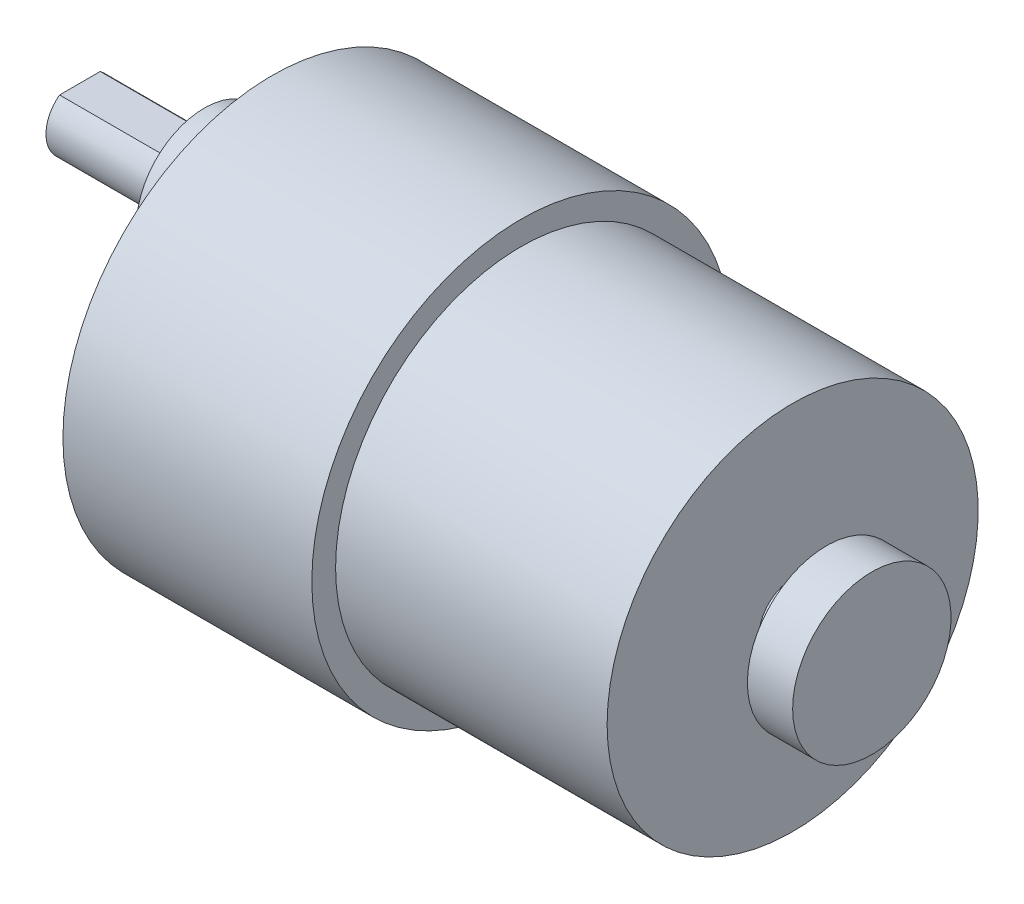
ISO-10303-21;
HEADER;
FILE_DESCRIPTION(('STEP AP214'),'2;1');
FILE_NAME('part.step','',(''),(''),'','','');
FILE_SCHEMA(('AUTOMOTIVE_DESIGN { 1 0 10303 214 1 1 1 1 }'));
ENDSEC;
DATA;
#1=APPLICATION_CONTEXT('core data for automotive mechanical design processes');
#2=APPLICATION_PROTOCOL_DEFINITION('international standard','automotive_design',2000,#1);
#3=PRODUCT_CONTEXT('',#1,'mechanical');
#4=PRODUCT('Part','Part','',(#3));
#5=PRODUCT_RELATED_PRODUCT_CATEGORY('part','',(#4));
#6=PRODUCT_DEFINITION_FORMATION('','',#4);
#7=PRODUCT_DEFINITION_CONTEXT('part definition',#1,'design');
#8=PRODUCT_DEFINITION('design','',#6,#7);
#9=PRODUCT_DEFINITION_SHAPE('','',#8);
#10=(LENGTH_UNIT() NAMED_UNIT(*) SI_UNIT(.MILLI.,.METRE.));
#11=(NAMED_UNIT(*) PLANE_ANGLE_UNIT() SI_UNIT($,.RADIAN.));
#12=(NAMED_UNIT(*) SI_UNIT($,.STERADIAN.) SOLID_ANGLE_UNIT());
#13=UNCERTAINTY_MEASURE_WITH_UNIT(LENGTH_MEASURE(1.E-05),#10,'distance_accuracy_value','');
#14=(GEOMETRIC_REPRESENTATION_CONTEXT(3) GLOBAL_UNCERTAINTY_ASSIGNED_CONTEXT((#13)) GLOBAL_UNIT_ASSIGNED_CONTEXT((#10,
#11,#12)) REPRESENTATION_CONTEXT('',''));
#15=CARTESIAN_POINT('',(0.,0.,0.));
#16=DIRECTION('',(0.,0.,1.));
#17=DIRECTION('',(1.,0.,0.));
#18=AXIS2_PLACEMENT_3D('',#15,#16,#17);
#19=CARTESIAN_POINT('',(-6.,7.,0.));
#20=DIRECTION('',(-1.,0.,0.));
#21=DIRECTION('',(0.,0.,1.));
#22=AXIS2_PLACEMENT_3D('',#19,#20,#21);
#23=PLANE('',#22);
#24=CARTESIAN_POINT('',(-6.,7.,0.));
#25=DIRECTION('',(-1.,0.,0.));
#26=DIRECTION('',(0.,0.,1.));
#27=AXIS2_PLACEMENT_3D('',#24,#25,#26);
#28=CIRCLE('',#27,6.);
#29=CARTESIAN_POINT('',(-6.,7.,6.));
#30=VERTEX_POINT('',#29);
#31=EDGE_CURVE('E92',#30,#30,#28,.T.);
#32=ORIENTED_EDGE('',*,*,#31,.T.);
#33=EDGE_LOOP('',(#32));
#34=FACE_BOUND('',#33,.T.);
#35=DIRECTION('',(0.,0.,-1.));
#36=VECTOR('',#35,1.);
#37=CARTESIAN_POINT('',(-6.,9.4,-1.8));
#38=LINE('',#37,#36);
#39=CARTESIAN_POINT('',(-6.,9.4,1.8));
#40=VERTEX_POINT('',#39);
#41=CARTESIAN_POINT('',(-6.,9.4,-1.8));
#42=VERTEX_POINT('',#41);
#43=EDGE_CURVE('E72',#40,#42,#38,.T.);
#44=ORIENTED_EDGE('',*,*,#43,.F.);
#45=CARTESIAN_POINT('',(-6.,7.,0.));
#46=DIRECTION('',(-1.,0.,0.));
#47=DIRECTION('',(0.,0.,1.));
#48=AXIS2_PLACEMENT_3D('',#45,#46,#47);
#49=CIRCLE('',#48,3.);
#50=EDGE_CURVE('E57',#42,#40,#49,.T.);
#51=ORIENTED_EDGE('',*,*,#50,.F.);
#52=EDGE_LOOP('',(#44,#51));
#53=FACE_BOUND('',#52,.T.);
#54=ADVANCED_FACE('F41',(#34,#53),#23,.T.);
#55=CARTESIAN_POINT('',(49.,0.,0.));
#56=DIRECTION('',(1.,0.,0.));
#57=DIRECTION('',(0.,0.,-1.));
#58=AXIS2_PLACEMENT_3D('',#55,#56,#57);
#59=PLANE('',#58);
#60=CARTESIAN_POINT('',(49.,0.,0.));
#61=DIRECTION('',(-1.,0.,0.));
#62=DIRECTION('',(0.,0.,1.));
#63=AXIS2_PLACEMENT_3D('',#60,#61,#62);
#64=CIRCLE('',#63,3.);
#65=CARTESIAN_POINT('',(49.,0.,3.));
#66=VERTEX_POINT('',#65);
#67=EDGE_CURVE('E11',#66,#66,#64,.T.);
#68=ORIENTED_EDGE('',*,*,#67,.F.);
#69=EDGE_LOOP('',(#68));
#70=FACE_BOUND('',#69,.T.);
#71=CARTESIAN_POINT('',(49.,0.,0.));
#72=DIRECTION('',(-1.,0.,0.));
#73=DIRECTION('',(0.,0.,1.));
#74=AXIS2_PLACEMENT_3D('',#71,#72,#73);
#75=CIRCLE('',#74,7.);
#76=CARTESIAN_POINT('',(49.,0.,7.));
#77=VERTEX_POINT('',#76);
#78=EDGE_CURVE('E96',#77,#77,#75,.T.);
#79=ORIENTED_EDGE('',*,*,#78,.T.);
#80=EDGE_LOOP('',(#79));
#81=FACE_BOUND('',#80,.T.);
#82=ADVANCED_FACE('F43',(#70,#81),#59,.F.);
#83=CARTESIAN_POINT('',(0.,0.,0.));
#84=DIRECTION('',(-1.,0.,0.));
#85=DIRECTION('',(0.,0.,1.));
#86=AXIS2_PLACEMENT_3D('',#83,#84,#85);
#87=CYLINDRICAL_SURFACE('',#86,3.);
#88=CARTESIAN_POINT('',(46.,0.,0.));
#89=DIRECTION('',(-1.,0.,0.));
#90=DIRECTION('',(0.,0.,1.));
#91=AXIS2_PLACEMENT_3D('',#88,#89,#90);
#92=CIRCLE('',#91,3.);
#93=CARTESIAN_POINT('',(46.,0.,3.));
#94=VERTEX_POINT('',#93);
#95=EDGE_CURVE('E50',#94,#94,#92,.T.);
#96=ORIENTED_EDGE('',*,*,#95,.F.);
#97=EDGE_LOOP('',(#96));
#98=FACE_BOUND('',#97,.T.);
#99=ORIENTED_EDGE('',*,*,#67,.T.);
#100=EDGE_LOOP('',(#99));
#101=FACE_BOUND('',#100,.T.);
#102=ADVANCED_FACE('F129',(#98,#101),#87,.T.);
#103=CARTESIAN_POINT('',(46.,0.,0.));
#104=DIRECTION('',(1.,0.,0.));
#105=DIRECTION('',(0.,0.,-1.));
#106=AXIS2_PLACEMENT_3D('',#103,#104,#105);
#107=PLANE('',#106);
#108=ORIENTED_EDGE('',*,*,#95,.T.);
#109=EDGE_LOOP('',(#108));
#110=FACE_BOUND('',#109,.T.);
#111=CARTESIAN_POINT('',(46.,0.,0.));
#112=DIRECTION('',(-1.,0.,0.));
#113=DIRECTION('',(0.,0.,1.));
#114=AXIS2_PLACEMENT_3D('',#111,#112,#113);
#115=CIRCLE('',#114,16.4);
#116=CARTESIAN_POINT('',(46.,0.,16.4));
#117=VERTEX_POINT('',#116);
#118=EDGE_CURVE('E119',#117,#117,#115,.T.);
#119=ORIENTED_EDGE('',*,*,#118,.F.);
#120=EDGE_LOOP('',(#119));
#121=FACE_BOUND('',#120,.T.);
#122=ADVANCED_FACE('F126',(#110,#121),#107,.T.);
#123=CARTESIAN_POINT('',(0.,0.,0.));
#124=DIRECTION('',(-1.,0.,0.));
#125=DIRECTION('',(0.,0.,1.));
#126=AXIS2_PLACEMENT_3D('',#123,#124,#125);
#127=CYLINDRICAL_SURFACE('',#126,16.4);
#128=ORIENTED_EDGE('',*,*,#118,.T.);
#129=EDGE_LOOP('',(#128));
#130=FACE_BOUND('',#129,.T.);
#131=CARTESIAN_POINT('',(22.,0.,0.));
#132=DIRECTION('',(-1.,0.,0.));
#133=DIRECTION('',(0.,0.,1.));
#134=AXIS2_PLACEMENT_3D('',#131,#132,#133);
#135=CIRCLE('',#134,16.4);
#136=CARTESIAN_POINT('',(22.,0.,16.4));
#137=VERTEX_POINT('',#136);
#138=EDGE_CURVE('E115',#137,#137,#135,.T.);
#139=ORIENTED_EDGE('',*,*,#138,.F.);
#140=EDGE_LOOP('',(#139));
#141=FACE_BOUND('',#140,.T.);
#142=ADVANCED_FACE('F230',(#130,#141),#127,.T.);
#143=CARTESIAN_POINT('',(22.,0.,0.));
#144=DIRECTION('',(1.,0.,0.));
#145=DIRECTION('',(0.,0.,-1.));
#146=AXIS2_PLACEMENT_3D('',#143,#144,#145);
#147=PLANE('',#146);
#148=ORIENTED_EDGE('',*,*,#138,.T.);
#149=EDGE_LOOP('',(#148));
#150=FACE_BOUND('',#149,.T.);
#151=CARTESIAN_POINT('',(22.,0.,0.));
#152=DIRECTION('',(-1.,0.,0.));
#153=DIRECTION('',(0.,0.,1.));
#154=AXIS2_PLACEMENT_3D('',#151,#152,#153);
#155=CIRCLE('',#154,18.5);
#156=CARTESIAN_POINT('',(22.,0.,18.5));
#157=VERTEX_POINT('',#156);
#158=EDGE_CURVE('E111',#157,#157,#155,.T.);
#159=ORIENTED_EDGE('',*,*,#158,.F.);
#160=EDGE_LOOP('',(#159));
#161=FACE_BOUND('',#160,.T.);
#162=ADVANCED_FACE('F220',(#150,#161),#147,.T.);
#163=CARTESIAN_POINT('',(0.,0.,0.));
#164=DIRECTION('',(-1.,0.,0.));
#165=DIRECTION('',(0.,0.,1.));
#166=AXIS2_PLACEMENT_3D('',#163,#164,#165);
#167=CYLINDRICAL_SURFACE('',#166,18.5);
#168=ORIENTED_EDGE('',*,*,#158,.T.);
#169=EDGE_LOOP('',(#168));
#170=FACE_BOUND('',#169,.T.);
#171=CARTESIAN_POINT('',(0.,0.,0.));
#172=DIRECTION('',(-1.,0.,0.));
#173=DIRECTION('',(0.,0.,1.));
#174=AXIS2_PLACEMENT_3D('',#171,#172,#173);
#175=CIRCLE('',#174,18.5);
#176=CARTESIAN_POINT('',(0.,0.,18.5));
#177=VERTEX_POINT('',#176);
#178=EDGE_CURVE('E107',#177,#177,#175,.T.);
#179=ORIENTED_EDGE('',*,*,#178,.F.);
#180=EDGE_LOOP('',(#179));
#181=FACE_BOUND('',#180,.T.);
#182=ADVANCED_FACE('F200',(#170,#181),#167,.T.);
#183=CARTESIAN_POINT('',(0.,0.,0.));
#184=DIRECTION('',(-1.,0.,0.));
#185=DIRECTION('',(0.,0.,1.));
#186=AXIS2_PLACEMENT_3D('',#183,#184,#185);
#187=PLANE('',#186);
#188=CARTESIAN_POINT('',(0.,7.,0.));
#189=DIRECTION('',(-1.,0.,0.));
#190=DIRECTION('',(0.,0.,1.));
#191=AXIS2_PLACEMENT_3D('',#188,#189,#190);
#192=CIRCLE('',#191,6.);
#193=CARTESIAN_POINT('',(0.,7.,6.));
#194=VERTEX_POINT('',#193);
#195=EDGE_CURVE('E91',#194,#194,#192,.T.);
#196=ORIENTED_EDGE('',*,*,#195,.F.);
#197=EDGE_LOOP('',(#196));
#198=FACE_BOUND('',#197,.T.);
#199=ORIENTED_EDGE('',*,*,#178,.T.);
#200=EDGE_LOOP('',(#199));
#201=FACE_BOUND('',#200,.T.);
#202=ADVANCED_FACE('F150',(#198,#201),#187,.T.);
#203=CARTESIAN_POINT('',(53.,0.,0.));
#204=DIRECTION('',(1.,0.,0.));
#205=DIRECTION('',(0.,0.,-1.));
#206=AXIS2_PLACEMENT_3D('',#203,#204,#205);
#207=PLANE('',#206);
#208=CARTESIAN_POINT('',(53.,0.,0.));
#209=DIRECTION('',(-1.,0.,0.));
#210=DIRECTION('',(0.,0.,1.));
#211=AXIS2_PLACEMENT_3D('',#208,#209,#210);
#212=CIRCLE('',#211,7.);
#213=CARTESIAN_POINT('',(53.,0.,7.));
#214=VERTEX_POINT('',#213);
#215=EDGE_CURVE('E103',#214,#214,#212,.T.);
#216=ORIENTED_EDGE('',*,*,#215,.F.);
#217=EDGE_LOOP('',(#216));
#218=FACE_BOUND('',#217,.T.);
#219=ADVANCED_FACE('F141',(#218),#207,.T.);
#220=CARTESIAN_POINT('',(0.,0.,0.));
#221=DIRECTION('',(-1.,0.,0.));
#222=DIRECTION('',(0.,0.,1.));
#223=AXIS2_PLACEMENT_3D('',#220,#221,#222);
#224=CYLINDRICAL_SURFACE('',#223,7.);
#225=ORIENTED_EDGE('',*,*,#215,.T.);
#226=EDGE_LOOP('',(#225));
#227=FACE_BOUND('',#226,.T.);
#228=ORIENTED_EDGE('',*,*,#78,.F.);
#229=EDGE_LOOP('',(#228));
#230=FACE_BOUND('',#229,.T.);
#231=ADVANCED_FACE('F138',(#227,#230),#224,.T.);
#232=CARTESIAN_POINT('',(-6.,7.,0.));
#233=DIRECTION('',(1.,0.,0.));
#234=DIRECTION('',(0.,0.,-1.));
#235=AXIS2_PLACEMENT_3D('',#232,#233,#234);
#236=CYLINDRICAL_SURFACE('',#235,6.);
#237=ORIENTED_EDGE('',*,*,#31,.F.);
#238=EDGE_LOOP('',(#237));
#239=FACE_BOUND('',#238,.T.);
#240=ORIENTED_EDGE('',*,*,#195,.T.);
#241=EDGE_LOOP('',(#240));
#242=FACE_BOUND('',#241,.T.);
#243=ADVANCED_FACE('F140',(#239,#242),#236,.T.);
#244=CARTESIAN_POINT('',(-17.,7.,0.));
#245=DIRECTION('',(1.,0.,0.));
#246=DIRECTION('',(0.,0.,-1.));
#247=AXIS2_PLACEMENT_3D('',#244,#245,#246);
#248=CYLINDRICAL_SURFACE('',#247,3.);
#249=ORIENTED_EDGE('',*,*,#50,.T.);
#250=DIRECTION('',(1.,0.,0.));
#251=VECTOR('',#250,1.);
#252=CARTESIAN_POINT('',(-17.,9.4,1.8));
#253=LINE('',#252,#251);
#254=CARTESIAN_POINT('',(-17.,9.4,1.8));
#255=VERTEX_POINT('',#254);
#256=EDGE_CURVE('E76',#255,#40,#253,.T.);
#257=ORIENTED_EDGE('',*,*,#256,.F.);
#258=CARTESIAN_POINT('',(-17.,7.,0.));
#259=DIRECTION('',(-1.,0.,0.));
#260=DIRECTION('',(0.,0.,1.));
#261=AXIS2_PLACEMENT_3D('',#258,#259,#260);
#262=CIRCLE('',#261,3.);
#263=CARTESIAN_POINT('',(-17.,9.4,-1.8));
#264=VERTEX_POINT('',#263);
#265=EDGE_CURVE('E79',#264,#255,#262,.T.);
#266=ORIENTED_EDGE('',*,*,#265,.F.);
#267=DIRECTION('',(1.,0.,0.));
#268=VECTOR('',#267,1.);
#269=CARTESIAN_POINT('',(-17.,9.4,-1.8));
#270=LINE('',#269,#268);
#271=EDGE_CURVE('E74',#264,#42,#270,.T.);
#272=ORIENTED_EDGE('',*,*,#271,.T.);
#273=EDGE_LOOP('',(#249,#257,#266,#272));
#274=FACE_BOUND('',#273,.T.);
#275=ADVANCED_FACE('F81',(#274),#248,.T.);
#276=CARTESIAN_POINT('',(-17.,9.4,-1.8));
#277=DIRECTION('',(0.,-1.,0.));
#278=DIRECTION('',(0.,0.,-1.));
#279=AXIS2_PLACEMENT_3D('',#276,#277,#278);
#280=PLANE('',#279);
#281=ORIENTED_EDGE('',*,*,#43,.T.);
#282=ORIENTED_EDGE('',*,*,#271,.F.);
#283=DIRECTION('',(0.,0.,-1.));
#284=VECTOR('',#283,1.);
#285=CARTESIAN_POINT('',(-17.,9.4,-1.8));
#286=LINE('',#285,#284);
#287=EDGE_CURVE('E65',#255,#264,#286,.T.);
#288=ORIENTED_EDGE('',*,*,#287,.F.);
#289=ORIENTED_EDGE('',*,*,#256,.T.);
#290=EDGE_LOOP('',(#281,#282,#288,#289));
#291=FACE_BOUND('',#290,.T.);
#292=ADVANCED_FACE('F73',(#291),#280,.F.);
#293=CARTESIAN_POINT('',(-17.,7.,0.));
#294=DIRECTION('',(-1.,0.,0.));
#295=DIRECTION('',(0.,0.,1.));
#296=AXIS2_PLACEMENT_3D('',#293,#294,#295);
#297=PLANE('',#296);
#298=ORIENTED_EDGE('',*,*,#265,.T.);
#299=ORIENTED_EDGE('',*,*,#287,.T.);
#300=EDGE_LOOP('',(#298,#299));
#301=FACE_BOUND('',#300,.T.);
#302=ADVANCED_FACE('F163',(#301),#297,.T.);
#303=CLOSED_SHELL('',(#54,#82,#102,#122,#142,#162,#182,#202,#219,#231,#243,#275,#292,#302));
#304=MANIFOLD_SOLID_BREP('B2',#303);
#305=ADVANCED_BREP_SHAPE_REPRESENTATION('',(#18,#304),#14);
#306=SHAPE_DEFINITION_REPRESENTATION(#9,#305);
ENDSEC;
END-ISO-10303-21;
